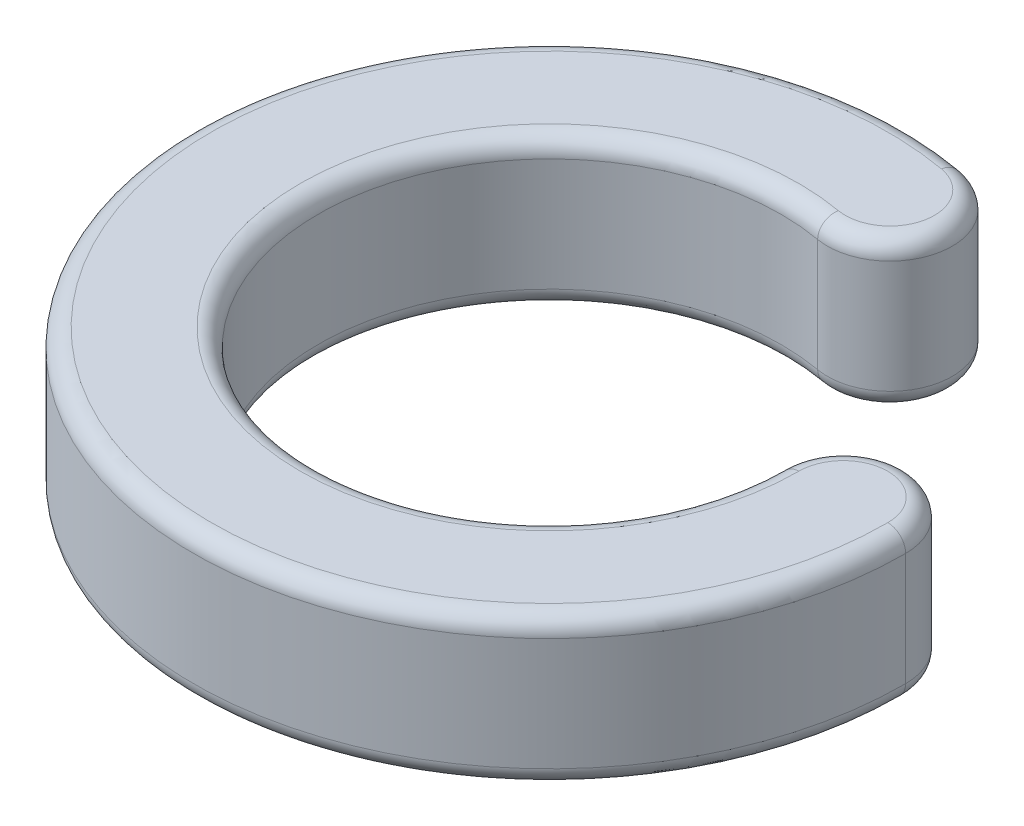
ISO-10303-21;
HEADER;
FILE_DESCRIPTION(('STEP AP214'),'2;1');
FILE_NAME('part.step','',(''),(''),'','','');
FILE_SCHEMA(('AUTOMOTIVE_DESIGN { 1 0 10303 214 1 1 1 1 }'));
ENDSEC;
DATA;
#1=APPLICATION_CONTEXT('core data for automotive mechanical design processes');
#2=APPLICATION_PROTOCOL_DEFINITION('international standard','automotive_design',2000,#1);
#3=PRODUCT_CONTEXT('',#1,'mechanical');
#4=PRODUCT('Part','Part','',(#3));
#5=PRODUCT_RELATED_PRODUCT_CATEGORY('part','',(#4));
#6=PRODUCT_DEFINITION_FORMATION('','',#4);
#7=PRODUCT_DEFINITION_CONTEXT('part definition',#1,'design');
#8=PRODUCT_DEFINITION('design','',#6,#7);
#9=PRODUCT_DEFINITION_SHAPE('','',#8);
#10=(LENGTH_UNIT() NAMED_UNIT(*) SI_UNIT(.MILLI.,.METRE.));
#11=(NAMED_UNIT(*) PLANE_ANGLE_UNIT() SI_UNIT($,.RADIAN.));
#12=(NAMED_UNIT(*) SI_UNIT($,.STERADIAN.) SOLID_ANGLE_UNIT());
#13=UNCERTAINTY_MEASURE_WITH_UNIT(LENGTH_MEASURE(1.E-05),#10,'distance_accuracy_value','');
#14=(GEOMETRIC_REPRESENTATION_CONTEXT(3) GLOBAL_UNCERTAINTY_ASSIGNED_CONTEXT((#13)) GLOBAL_UNIT_ASSIGNED_CONTEXT((#10,
#11,#12)) REPRESENTATION_CONTEXT('',''));
#15=CARTESIAN_POINT('',(0.,0.,0.));
#16=DIRECTION('',(0.,0.,1.));
#17=DIRECTION('',(1.,0.,0.));
#18=AXIS2_PLACEMENT_3D('',#15,#16,#17);
#19=CARTESIAN_POINT('',(4.95,2.5,0.));
#20=DIRECTION('',(0.,-1.,0.));
#21=DIRECTION('',(0.,0.,-1.));
#22=AXIS2_PLACEMENT_3D('',#19,#20,#21);
#23=CYLINDRICAL_SURFACE('',#22,1.05);
#24=DIRECTION('',(0.,-1.,0.));
#25=VECTOR('',#24,1.);
#26=CARTESIAN_POINT('',(6.,2.5,0.));
#27=LINE('',#26,#25);
#28=CARTESIAN_POINT('',(6.,2.2,0.));
#29=VERTEX_POINT('',#28);
#30=CARTESIAN_POINT('',(6.,0.3,0.));
#31=VERTEX_POINT('',#30);
#32=EDGE_CURVE('E162',#29,#31,#27,.T.);
#33=ORIENTED_EDGE('',*,*,#32,.T.);
#34=CARTESIAN_POINT('',(4.95,0.3,0.));
#35=DIRECTION('',(0.,1.,0.));
#36=DIRECTION('',(0.,0.,1.));
#37=AXIS2_PLACEMENT_3D('',#34,#35,#36);
#38=CIRCLE('',#37,1.05);
#39=CARTESIAN_POINT('',(3.9,0.3,0.));
#40=VERTEX_POINT('',#39);
#41=EDGE_CURVE('E49',#31,#40,#38,.T.);
#42=ORIENTED_EDGE('',*,*,#41,.T.);
#43=DIRECTION('',(0.,-1.,0.));
#44=VECTOR('',#43,1.);
#45=CARTESIAN_POINT('',(3.9,2.5,0.));
#46=LINE('',#45,#44);
#47=CARTESIAN_POINT('',(3.9,2.2,0.));
#48=VERTEX_POINT('',#47);
#49=EDGE_CURVE('E130',#48,#40,#46,.T.);
#50=ORIENTED_EDGE('',*,*,#49,.F.);
#51=CARTESIAN_POINT('',(4.95,2.2,0.));
#52=DIRECTION('',(0.,1.,0.));
#53=DIRECTION('',(0.,0.,1.));
#54=AXIS2_PLACEMENT_3D('',#51,#52,#53);
#55=CIRCLE('',#54,1.05);
#56=EDGE_CURVE('E147',#48,#29,#55,.F.);
#57=ORIENTED_EDGE('',*,*,#56,.T.);
#58=EDGE_LOOP('',(#33,#42,#50,#57));
#59=FACE_BOUND('',#58,.T.);
#60=ADVANCED_FACE('F39',(#59),#23,.T.);
#61=CARTESIAN_POINT('',(0.,2.5,0.));
#62=DIRECTION('',(0.,-1.,0.));
#63=DIRECTION('',(0.,0.,-1.));
#64=AXIS2_PLACEMENT_3D('',#61,#62,#63);
#65=CYLINDRICAL_SURFACE('',#64,3.9);
#66=ORIENTED_EDGE('',*,*,#49,.T.);
#67=CARTESIAN_POINT('',(0.,0.3,0.));
#68=DIRECTION('',(0.,1.,0.));
#69=DIRECTION('',(0.,0.,1.));
#70=AXIS2_PLACEMENT_3D('',#67,#68,#69);
#71=CIRCLE('',#70,3.9);
#72=CARTESIAN_POINT('',(0.677227892901017,0.3,-3.84075023674761));
#73=VERTEX_POINT('',#72);
#74=EDGE_CURVE('E11',#40,#73,#71,.F.);
#75=ORIENTED_EDGE('',*,*,#74,.T.);
#76=DIRECTION('',(0.,-1.,0.));
#77=VECTOR('',#76,1.);
#78=CARTESIAN_POINT('',(0.677227892901017,2.5,-3.84075023674761));
#79=LINE('',#78,#77);
#80=CARTESIAN_POINT('',(0.677227892901017,2.2,-3.84075023674761));
#81=VERTEX_POINT('',#80);
#82=EDGE_CURVE('E218',#81,#73,#79,.T.);
#83=ORIENTED_EDGE('',*,*,#82,.F.);
#84=CARTESIAN_POINT('',(0.,2.2,0.));
#85=DIRECTION('',(0.,1.,0.));
#86=DIRECTION('',(0.,0.,1.));
#87=AXIS2_PLACEMENT_3D('',#84,#85,#86);
#88=CIRCLE('',#87,3.9);
#89=EDGE_CURVE('E140',#81,#48,#88,.T.);
#90=ORIENTED_EDGE('',*,*,#89,.T.);
#91=EDGE_LOOP('',(#66,#75,#83,#90));
#92=FACE_BOUND('',#91,.T.);
#93=ADVANCED_FACE('F237',(#92),#65,.F.);
#94=CARTESIAN_POINT('',(0.859558479451292,2.5,-4.87479837741043));
#95=DIRECTION('',(0.,-1.,0.));
#96=DIRECTION('',(0.,0.,-1.));
#97=AXIS2_PLACEMENT_3D('',#94,#95,#96);
#98=CYLINDRICAL_SURFACE('',#97,1.05);
#99=ORIENTED_EDGE('',*,*,#82,.T.);
#100=CARTESIAN_POINT('',(0.859558479451292,0.3,-4.87479837741043));
#101=DIRECTION('',(0.,1.,0.));
#102=DIRECTION('',(0.,0.,1.));
#103=AXIS2_PLACEMENT_3D('',#100,#101,#102);
#104=CIRCLE('',#103,1.05);
#105=CARTESIAN_POINT('',(1.04188906600156,0.3,-5.90884651807325));
#106=VERTEX_POINT('',#105);
#107=EDGE_CURVE('E152',#73,#106,#104,.T.);
#108=ORIENTED_EDGE('',*,*,#107,.T.);
#109=DIRECTION('',(0.,-1.,0.));
#110=VECTOR('',#109,1.);
#111=CARTESIAN_POINT('',(1.04188906600156,2.5,-5.90884651807325));
#112=LINE('',#111,#110);
#113=CARTESIAN_POINT('',(1.04188906600156,2.2,-5.90884651807325));
#114=VERTEX_POINT('',#113);
#115=EDGE_CURVE('E216',#114,#106,#112,.T.);
#116=ORIENTED_EDGE('',*,*,#115,.F.);
#117=CARTESIAN_POINT('',(0.859558479451292,2.2,-4.87479837741043));
#118=DIRECTION('',(0.,1.,0.));
#119=DIRECTION('',(0.,0.,1.));
#120=AXIS2_PLACEMENT_3D('',#117,#118,#119);
#121=CIRCLE('',#120,1.05);
#122=EDGE_CURVE('E115',#114,#81,#121,.F.);
#123=ORIENTED_EDGE('',*,*,#122,.T.);
#124=EDGE_LOOP('',(#99,#108,#116,#123));
#125=FACE_BOUND('',#124,.T.);
#126=ADVANCED_FACE('F215',(#125),#98,.T.);
#127=CARTESIAN_POINT('',(0.,2.5,0.));
#128=DIRECTION('',(0.,-1.,0.));
#129=DIRECTION('',(0.,0.,-1.));
#130=AXIS2_PLACEMENT_3D('',#127,#128,#129);
#131=CYLINDRICAL_SURFACE('',#130,6.);
#132=ORIENTED_EDGE('',*,*,#115,.T.);
#133=CARTESIAN_POINT('',(0.,0.3,0.));
#134=DIRECTION('',(0.,1.,0.));
#135=DIRECTION('',(0.,0.,1.));
#136=AXIS2_PLACEMENT_3D('',#133,#134,#135);
#137=CIRCLE('',#136,6.);
#138=EDGE_CURVE('E64',#106,#31,#137,.T.);
#139=ORIENTED_EDGE('',*,*,#138,.T.);
#140=ORIENTED_EDGE('',*,*,#32,.F.);
#141=CARTESIAN_POINT('',(0.,2.2,0.));
#142=DIRECTION('',(0.,1.,0.));
#143=DIRECTION('',(0.,0.,1.));
#144=AXIS2_PLACEMENT_3D('',#141,#142,#143);
#145=CIRCLE('',#144,6.);
#146=EDGE_CURVE('E150',#29,#114,#145,.F.);
#147=ORIENTED_EDGE('',*,*,#146,.T.);
#148=EDGE_LOOP('',(#132,#139,#140,#147));
#149=FACE_BOUND('',#148,.T.);
#150=ADVANCED_FACE('F219',(#149),#131,.T.);
#151=CARTESIAN_POINT('',(2.475,2.5,0.));
#152=DIRECTION('',(0.,1.,0.));
#153=DIRECTION('',(0.,0.,1.));
#154=AXIS2_PLACEMENT_3D('',#151,#152,#153);
#155=PLANE('',#154);
#156=CARTESIAN_POINT('',(0.,2.5,0.));
#157=DIRECTION('',(0.,1.,0.));
#158=DIRECTION('',(0.,0.,1.));
#159=AXIS2_PLACEMENT_3D('',#156,#157,#158);
#160=CIRCLE('',#159,4.2);
#161=CARTESIAN_POINT('',(4.2,2.5,0.));
#162=VERTEX_POINT('',#161);
#163=CARTESIAN_POINT('',(0.729322346201096,2.5,-4.13619256265128));
#164=VERTEX_POINT('',#163);
#165=EDGE_CURVE('E134',#162,#164,#160,.F.);
#166=ORIENTED_EDGE('',*,*,#165,.T.);
#167=CARTESIAN_POINT('',(0.859558479451292,2.5,-4.87479837741043));
#168=DIRECTION('',(0.,1.,0.));
#169=DIRECTION('',(0.,0.,1.));
#170=AXIS2_PLACEMENT_3D('',#167,#168,#169);
#171=CIRCLE('',#170,0.75);
#172=CARTESIAN_POINT('',(0.989794612701487,2.5,-5.61340419216959));
#173=VERTEX_POINT('',#172);
#174=EDGE_CURVE('E113',#164,#173,#171,.T.);
#175=ORIENTED_EDGE('',*,*,#174,.T.);
#176=CARTESIAN_POINT('',(0.,2.5,0.));
#177=DIRECTION('',(0.,1.,0.));
#178=DIRECTION('',(0.,0.,1.));
#179=AXIS2_PLACEMENT_3D('',#176,#177,#178);
#180=CIRCLE('',#179,5.7);
#181=CARTESIAN_POINT('',(5.7,2.5,0.));
#182=VERTEX_POINT('',#181);
#183=EDGE_CURVE('E122',#173,#182,#180,.T.);
#184=ORIENTED_EDGE('',*,*,#183,.T.);
#185=CARTESIAN_POINT('',(4.95,2.5,0.));
#186=DIRECTION('',(0.,1.,0.));
#187=DIRECTION('',(0.,0.,1.));
#188=AXIS2_PLACEMENT_3D('',#185,#186,#187);
#189=CIRCLE('',#188,0.75);
#190=EDGE_CURVE('E129',#182,#162,#189,.T.);
#191=ORIENTED_EDGE('',*,*,#190,.T.);
#192=EDGE_LOOP('',(#166,#175,#184,#191));
#193=FACE_BOUND('',#192,.T.);
#194=ADVANCED_FACE('F132',(#193),#155,.T.);
#195=CARTESIAN_POINT('',(2.475,0.,0.));
#196=DIRECTION('',(0.,1.,0.));
#197=DIRECTION('',(0.,0.,1.));
#198=AXIS2_PLACEMENT_3D('',#195,#196,#197);
#199=PLANE('',#198);
#200=CARTESIAN_POINT('',(0.,0.,0.));
#201=DIRECTION('',(0.,1.,0.));
#202=DIRECTION('',(0.,0.,1.));
#203=AXIS2_PLACEMENT_3D('',#200,#201,#202);
#204=CIRCLE('',#203,5.7);
#205=CARTESIAN_POINT('',(5.7,0.,0.));
#206=VERTEX_POINT('',#205);
#207=CARTESIAN_POINT('',(0.989794612701487,0.,-5.61340419216959));
#208=VERTEX_POINT('',#207);
#209=EDGE_CURVE('E172',#206,#208,#204,.F.);
#210=ORIENTED_EDGE('',*,*,#209,.T.);
#211=CARTESIAN_POINT('',(0.859558479451292,0.,-4.87479837741043));
#212=DIRECTION('',(0.,1.,0.));
#213=DIRECTION('',(0.,0.,1.));
#214=AXIS2_PLACEMENT_3D('',#211,#212,#213);
#215=CIRCLE('',#214,0.75);
#216=CARTESIAN_POINT('',(0.729322346201096,0.,-4.13619256265128));
#217=VERTEX_POINT('',#216);
#218=EDGE_CURVE('E175',#208,#217,#215,.F.);
#219=ORIENTED_EDGE('',*,*,#218,.T.);
#220=CARTESIAN_POINT('',(0.,0.,0.));
#221=DIRECTION('',(0.,1.,0.));
#222=DIRECTION('',(0.,0.,1.));
#223=AXIS2_PLACEMENT_3D('',#220,#221,#222);
#224=CIRCLE('',#223,4.2);
#225=CARTESIAN_POINT('',(4.2,0.,0.));
#226=VERTEX_POINT('',#225);
#227=EDGE_CURVE('E166',#217,#226,#224,.T.);
#228=ORIENTED_EDGE('',*,*,#227,.T.);
#229=CARTESIAN_POINT('',(4.95,0.,0.));
#230=DIRECTION('',(0.,1.,0.));
#231=DIRECTION('',(0.,0.,1.));
#232=AXIS2_PLACEMENT_3D('',#229,#230,#231);
#233=CIRCLE('',#232,0.75);
#234=EDGE_CURVE('E169',#226,#206,#233,.F.);
#235=ORIENTED_EDGE('',*,*,#234,.T.);
#236=EDGE_LOOP('',(#210,#219,#228,#235));
#237=FACE_BOUND('',#236,.T.);
#238=ADVANCED_FACE('F205',(#237),#199,.F.);
#239=CARTESIAN_POINT('',(4.95,2.2,0.));
#240=DIRECTION('',(0.,1.,0.));
#241=DIRECTION('',(0.,0.,1.));
#242=AXIS2_PLACEMENT_3D('',#239,#240,#241);
#243=TOROIDAL_SURFACE('',#242,0.75,0.3);
#244=CARTESIAN_POINT('',(5.7,2.2,0.));
#245=DIRECTION('',(0.,0.,1.));
#246=DIRECTION('',(1.,0.,0.));
#247=AXIS2_PLACEMENT_3D('',#244,#245,#246);
#248=CIRCLE('',#247,0.3);
#249=EDGE_CURVE('E125',#29,#182,#248,.T.);
#250=ORIENTED_EDGE('',*,*,#249,.F.);
#251=ORIENTED_EDGE('',*,*,#56,.F.);
#252=CARTESIAN_POINT('',(4.2,2.2,0.));
#253=DIRECTION('',(0.,0.,1.));
#254=DIRECTION('',(1.,0.,0.));
#255=AXIS2_PLACEMENT_3D('',#252,#253,#254);
#256=CIRCLE('',#255,0.3);
#257=EDGE_CURVE('E158',#162,#48,#256,.T.);
#258=ORIENTED_EDGE('',*,*,#257,.F.);
#259=ORIENTED_EDGE('',*,*,#190,.F.);
#260=EDGE_LOOP('',(#250,#251,#258,#259));
#261=FACE_BOUND('',#260,.T.);
#262=ADVANCED_FACE('F232',(#261),#243,.T.);
#263=CARTESIAN_POINT('',(0.,2.2,0.));
#264=DIRECTION('',(0.,1.,0.));
#265=DIRECTION('',(0.,0.,1.));
#266=AXIS2_PLACEMENT_3D('',#263,#264,#265);
#267=TOROIDAL_SURFACE('',#266,4.2,0.3);
#268=ORIENTED_EDGE('',*,*,#257,.T.);
#269=ORIENTED_EDGE('',*,*,#89,.F.);
#270=CARTESIAN_POINT('',(0.729322346201096,2.2,-4.13619256265128));
#271=DIRECTION('',(0.984807753012208,0.,0.173648177666928));
#272=DIRECTION('',(0.173648177666928,0.,-0.984807753012209));
#273=AXIS2_PLACEMENT_3D('',#270,#271,#272);
#274=CIRCLE('',#273,0.3);
#275=EDGE_CURVE('E119',#164,#81,#274,.T.);
#276=ORIENTED_EDGE('',*,*,#275,.F.);
#277=ORIENTED_EDGE('',*,*,#165,.F.);
#278=EDGE_LOOP('',(#268,#269,#276,#277));
#279=FACE_BOUND('',#278,.T.);
#280=ADVANCED_FACE('F235',(#279),#267,.T.);
#281=CARTESIAN_POINT('',(0.,2.2,0.));
#282=DIRECTION('',(0.,1.,0.));
#283=DIRECTION('',(0.,0.,1.));
#284=AXIS2_PLACEMENT_3D('',#281,#282,#283);
#285=TOROIDAL_SURFACE('',#284,5.7,0.3);
#286=ORIENTED_EDGE('',*,*,#249,.T.);
#287=ORIENTED_EDGE('',*,*,#183,.F.);
#288=CARTESIAN_POINT('',(0.989794612701486,2.2,-5.61340419216959));
#289=DIRECTION('',(0.984807753012208,0.,0.173648177666927));
#290=DIRECTION('',(0.173648177666927,0.,-0.984807753012209));
#291=AXIS2_PLACEMENT_3D('',#288,#289,#290);
#292=CIRCLE('',#291,0.3);
#293=EDGE_CURVE('E109',#114,#173,#292,.T.);
#294=ORIENTED_EDGE('',*,*,#293,.F.);
#295=ORIENTED_EDGE('',*,*,#146,.F.);
#296=EDGE_LOOP('',(#286,#287,#294,#295));
#297=FACE_BOUND('',#296,.T.);
#298=ADVANCED_FACE('F123',(#297),#285,.T.);
#299=CARTESIAN_POINT('',(0.859558479451292,2.2,-4.87479837741043));
#300=DIRECTION('',(0.,1.,0.));
#301=DIRECTION('',(0.,0.,1.));
#302=AXIS2_PLACEMENT_3D('',#299,#300,#301);
#303=TOROIDAL_SURFACE('',#302,0.75,0.3);
#304=ORIENTED_EDGE('',*,*,#275,.T.);
#305=ORIENTED_EDGE('',*,*,#122,.F.);
#306=ORIENTED_EDGE('',*,*,#293,.T.);
#307=ORIENTED_EDGE('',*,*,#174,.F.);
#308=EDGE_LOOP('',(#304,#305,#306,#307));
#309=FACE_BOUND('',#308,.T.);
#310=ADVANCED_FACE('F111',(#309),#303,.T.);
#311=CARTESIAN_POINT('',(4.95,0.3,0.));
#312=DIRECTION('',(0.,1.,0.));
#313=DIRECTION('',(0.,0.,1.));
#314=AXIS2_PLACEMENT_3D('',#311,#312,#313);
#315=TOROIDAL_SURFACE('',#314,0.75,0.3);
#316=CARTESIAN_POINT('',(5.7,0.3,0.));
#317=DIRECTION('',(0.,0.,1.));
#318=DIRECTION('',(1.,0.,0.));
#319=AXIS2_PLACEMENT_3D('',#316,#317,#318);
#320=CIRCLE('',#319,0.3);
#321=EDGE_CURVE('E188',#206,#31,#320,.T.);
#322=ORIENTED_EDGE('',*,*,#321,.F.);
#323=ORIENTED_EDGE('',*,*,#234,.F.);
#324=CARTESIAN_POINT('',(4.2,0.3,0.));
#325=DIRECTION('',(0.,0.,1.));
#326=DIRECTION('',(1.,0.,0.));
#327=AXIS2_PLACEMENT_3D('',#324,#325,#326);
#328=CIRCLE('',#327,0.3);
#329=EDGE_CURVE('E43',#40,#226,#328,.T.);
#330=ORIENTED_EDGE('',*,*,#329,.F.);
#331=ORIENTED_EDGE('',*,*,#41,.F.);
#332=EDGE_LOOP('',(#322,#323,#330,#331));
#333=FACE_BOUND('',#332,.T.);
#334=ADVANCED_FACE('F41',(#333),#315,.T.);
#335=CARTESIAN_POINT('',(0.,0.3,0.));
#336=DIRECTION('',(0.,1.,0.));
#337=DIRECTION('',(0.,0.,1.));
#338=AXIS2_PLACEMENT_3D('',#335,#336,#337);
#339=TOROIDAL_SURFACE('',#338,4.2,0.3);
#340=ORIENTED_EDGE('',*,*,#329,.T.);
#341=ORIENTED_EDGE('',*,*,#227,.F.);
#342=CARTESIAN_POINT('',(0.729322346201096,0.3,-4.13619256265128));
#343=DIRECTION('',(0.984807753012208,0.,0.173648177666928));
#344=DIRECTION('',(0.173648177666928,0.,-0.984807753012209));
#345=AXIS2_PLACEMENT_3D('',#342,#343,#344);
#346=CIRCLE('',#345,0.3);
#347=EDGE_CURVE('E186',#73,#217,#346,.T.);
#348=ORIENTED_EDGE('',*,*,#347,.F.);
#349=ORIENTED_EDGE('',*,*,#74,.F.);
#350=EDGE_LOOP('',(#340,#341,#348,#349));
#351=FACE_BOUND('',#350,.T.);
#352=ADVANCED_FACE('F200',(#351),#339,.T.);
#353=CARTESIAN_POINT('',(0.,0.3,0.));
#354=DIRECTION('',(0.,1.,0.));
#355=DIRECTION('',(0.,0.,1.));
#356=AXIS2_PLACEMENT_3D('',#353,#354,#355);
#357=TOROIDAL_SURFACE('',#356,5.7,0.3);
#358=ORIENTED_EDGE('',*,*,#321,.T.);
#359=ORIENTED_EDGE('',*,*,#138,.F.);
#360=CARTESIAN_POINT('',(0.989794612701487,0.3,-5.61340419216959));
#361=DIRECTION('',(0.984807753012209,0.,0.173648177666927));
#362=DIRECTION('',(0.173648177666927,0.,-0.984807753012209));
#363=AXIS2_PLACEMENT_3D('',#360,#361,#362);
#364=CIRCLE('',#363,0.3);
#365=EDGE_CURVE('E183',#208,#106,#364,.T.);
#366=ORIENTED_EDGE('',*,*,#365,.F.);
#367=ORIENTED_EDGE('',*,*,#209,.F.);
#368=EDGE_LOOP('',(#358,#359,#366,#367));
#369=FACE_BOUND('',#368,.T.);
#370=ADVANCED_FACE('F211',(#369),#357,.T.);
#371=CARTESIAN_POINT('',(0.859558479451292,0.3,-4.87479837741043));
#372=DIRECTION('',(0.,1.,0.));
#373=DIRECTION('',(0.,0.,1.));
#374=AXIS2_PLACEMENT_3D('',#371,#372,#373);
#375=TOROIDAL_SURFACE('',#374,0.75,0.3);
#376=ORIENTED_EDGE('',*,*,#347,.T.);
#377=ORIENTED_EDGE('',*,*,#218,.F.);
#378=ORIENTED_EDGE('',*,*,#365,.T.);
#379=ORIENTED_EDGE('',*,*,#107,.F.);
#380=EDGE_LOOP('',(#376,#377,#378,#379));
#381=FACE_BOUND('',#380,.T.);
#382=ADVANCED_FACE('F209',(#381),#375,.T.);
#383=CLOSED_SHELL('',(#60,#93,#126,#150,#194,#238,#262,#280,#298,#310,#334,#352,#370,#382));
#384=MANIFOLD_SOLID_BREP('B2',#383);
#385=ADVANCED_BREP_SHAPE_REPRESENTATION('',(#18,#384),#14);
#386=SHAPE_DEFINITION_REPRESENTATION(#9,#385);
ENDSEC;
END-ISO-10303-21;
